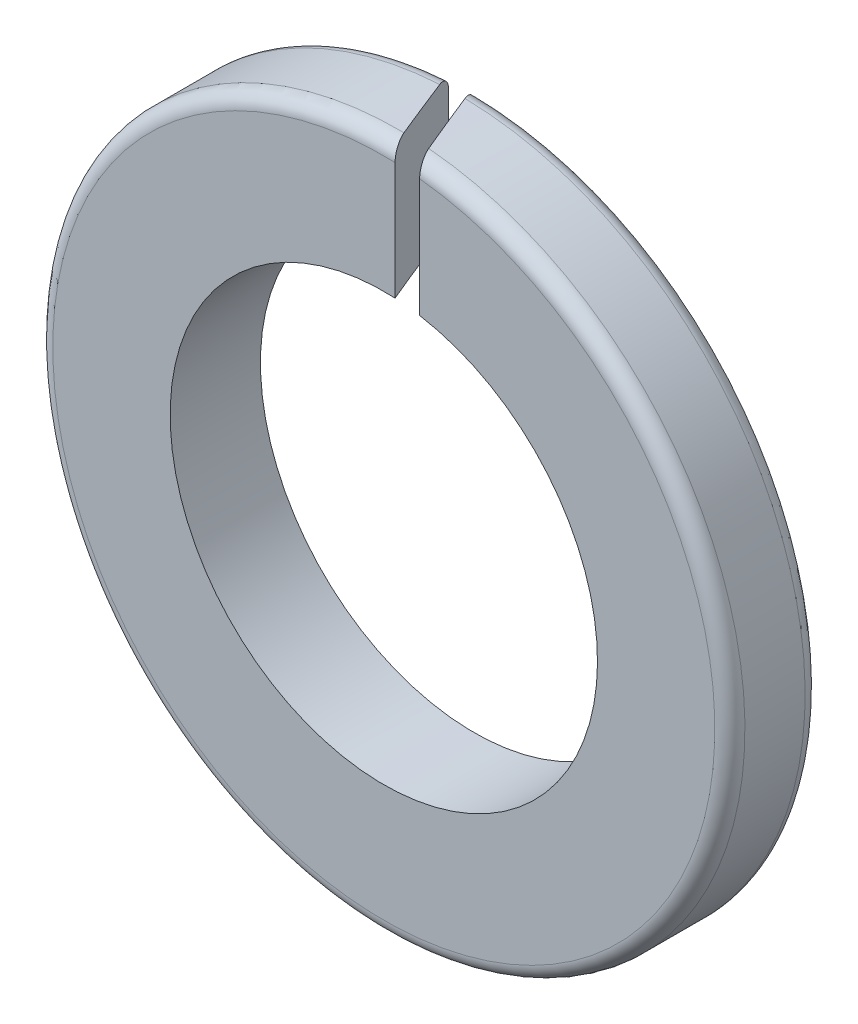
ISO-10303-21;
HEADER;
FILE_DESCRIPTION(('STEP AP214'),'2;1');
FILE_NAME('part.step','',(''),(''),'','','');
FILE_SCHEMA(('AUTOMOTIVE_DESIGN { 1 0 10303 214 1 1 1 1 }'));
ENDSEC;
DATA;
#1=APPLICATION_CONTEXT('core data for automotive mechanical design processes');
#2=APPLICATION_PROTOCOL_DEFINITION('international standard','automotive_design',2000,#1);
#3=PRODUCT_CONTEXT('',#1,'mechanical');
#4=PRODUCT('Part','Part','',(#3));
#5=PRODUCT_RELATED_PRODUCT_CATEGORY('part','',(#4));
#6=PRODUCT_DEFINITION_FORMATION('','',#4);
#7=PRODUCT_DEFINITION_CONTEXT('part definition',#1,'design');
#8=PRODUCT_DEFINITION('design','',#6,#7);
#9=PRODUCT_DEFINITION_SHAPE('','',#8);
#10=(LENGTH_UNIT() NAMED_UNIT(*) SI_UNIT(.MILLI.,.METRE.));
#11=(NAMED_UNIT(*) PLANE_ANGLE_UNIT() SI_UNIT($,.RADIAN.));
#12=(NAMED_UNIT(*) SI_UNIT($,.STERADIAN.) SOLID_ANGLE_UNIT());
#13=UNCERTAINTY_MEASURE_WITH_UNIT(LENGTH_MEASURE(1.E-05),#10,'distance_accuracy_value','');
#14=(GEOMETRIC_REPRESENTATION_CONTEXT(3) GLOBAL_UNCERTAINTY_ASSIGNED_CONTEXT((#13)) GLOBAL_UNIT_ASSIGNED_CONTEXT((#10,
#11,#12)) REPRESENTATION_CONTEXT('',''));
#15=CARTESIAN_POINT('',(0.,0.,0.));
#16=DIRECTION('',(0.,0.,1.));
#17=DIRECTION('',(1.,0.,0.));
#18=AXIS2_PLACEMENT_3D('',#15,#16,#17);
#19=CARTESIAN_POINT('',(0.,0.,3.));
#20=DIRECTION('',(0.,0.,1.));
#21=DIRECTION('',(1.,0.,0.));
#22=AXIS2_PLACEMENT_3D('',#19,#20,#21);
#23=PLANE('',#22);
#24=CARTESIAN_POINT('',(0.,0.,3.));
#25=DIRECTION('',(0.,0.,1.));
#26=DIRECTION('',(1.,0.,0.));
#27=AXIS2_PLACEMENT_3D('',#24,#25,#26);
#28=CIRCLE('',#27,7.1);
#29=CARTESIAN_POINT('',(0.373498300515705,7.09016918130392,3.));
#30=VERTEX_POINT('',#29);
#31=CARTESIAN_POINT('',(1.19000632074208,6.99956319755696,3.));
#32=VERTEX_POINT('',#31);
#33=EDGE_CURVE('E112',#30,#32,#28,.T.);
#34=ORIENTED_EDGE('',*,*,#33,.F.);
#35=DIRECTION('',(0.,1.,0.));
#36=VECTOR('',#35,1.);
#37=CARTESIAN_POINT('',(0.373498300515705,0.,3.));
#38=LINE('',#37,#36);
#39=CARTESIAN_POINT('',(0.373498300515705,10.9936572176647,3.));
#40=VERTEX_POINT('',#39);
#41=EDGE_CURVE('E170',#30,#40,#38,.T.);
#42=ORIENTED_EDGE('',*,*,#41,.T.);
#43=CARTESIAN_POINT('',(0.,0.,3.));
#44=DIRECTION('',(0.,0.,1.));
#45=DIRECTION('',(1.,0.,0.));
#46=AXIS2_PLACEMENT_3D('',#43,#44,#45);
#47=CIRCLE('',#46,11.);
#48=CARTESIAN_POINT('',(1.19000632074208,10.935441690055,3.));
#49=VERTEX_POINT('',#48);
#50=EDGE_CURVE('E101',#40,#49,#47,.T.);
#51=ORIENTED_EDGE('',*,*,#50,.T.);
#52=DIRECTION('',(0.,-1.,0.));
#53=VECTOR('',#52,1.);
#54=CARTESIAN_POINT('',(1.19000632074208,0.,3.));
#55=LINE('',#54,#53);
#56=EDGE_CURVE('E58',#49,#32,#55,.T.);
#57=ORIENTED_EDGE('',*,*,#56,.T.);
#58=EDGE_LOOP('',(#34,#42,#51,#57));
#59=FACE_BOUND('',#58,.T.);
#60=ADVANCED_FACE('F36',(#59),#23,.T.);
#61=CARTESIAN_POINT('',(0.,0.,0.));
#62=DIRECTION('',(0.,0.,1.));
#63=DIRECTION('',(1.,0.,0.));
#64=AXIS2_PLACEMENT_3D('',#61,#62,#63);
#65=PLANE('',#64);
#66=DIRECTION('',(0.,1.,0.));
#67=VECTOR('',#66,1.);
#68=CARTESIAN_POINT('',(-0.845251699484295,0.,0.));
#69=LINE('',#68,#67);
#70=CARTESIAN_POINT('',(-0.845251699484295,7.04950704407896,0.));
#71=VERTEX_POINT('',#70);
#72=CARTESIAN_POINT('',(-0.845251699484295,10.9674769005692,0.));
#73=VERTEX_POINT('',#72);
#74=EDGE_CURVE('E175',#71,#73,#69,.T.);
#75=ORIENTED_EDGE('',*,*,#74,.F.);
#76=CARTESIAN_POINT('',(0.,0.,0.));
#77=DIRECTION('',(0.,0.,1.));
#78=DIRECTION('',(1.,0.,0.));
#79=AXIS2_PLACEMENT_3D('',#76,#77,#78);
#80=CIRCLE('',#79,7.1);
#81=CARTESIAN_POINT('',(-0.00195796497220551,7.09999973002627,0.));
#82=VERTEX_POINT('',#81);
#83=EDGE_CURVE('E120',#71,#82,#80,.T.);
#84=ORIENTED_EDGE('',*,*,#83,.T.);
#85=DIRECTION('',(0.,-1.,0.));
#86=VECTOR('',#85,1.);
#87=CARTESIAN_POINT('',(-0.00195796497220559,0.,0.));
#88=LINE('',#87,#86);
#89=CARTESIAN_POINT('',(-0.00195796497220562,10.9999998257442,0.));
#90=VERTEX_POINT('',#89);
#91=EDGE_CURVE('E183',#90,#82,#88,.T.);
#92=ORIENTED_EDGE('',*,*,#91,.F.);
#93=CARTESIAN_POINT('',(0.,0.,0.));
#94=DIRECTION('',(0.,0.,1.));
#95=DIRECTION('',(1.,0.,0.));
#96=AXIS2_PLACEMENT_3D('',#93,#94,#95);
#97=CIRCLE('',#96,11.);
#98=EDGE_CURVE('E117',#90,#73,#97,.F.);
#99=ORIENTED_EDGE('',*,*,#98,.T.);
#100=EDGE_LOOP('',(#75,#84,#92,#99));
#101=FACE_BOUND('',#100,.T.);
#102=ADVANCED_FACE('F182',(#101),#65,.F.);
#103=CARTESIAN_POINT('',(0.,0.,3.));
#104=DIRECTION('',(0.,0.,-1.));
#105=DIRECTION('',(-1.,0.,0.));
#106=AXIS2_PLACEMENT_3D('',#103,#104,#105);
#107=CYLINDRICAL_SURFACE('',#106,11.5);
#108=CARTESIAN_POINT('',(0.,0.,2.08061956796134));
#109=DIRECTION('',(0.926466577122309,0.,-0.376377046955938));
#110=DIRECTION('',(-0.376377046955938,0.,-0.926466577122309));
#111=AXIS2_PLACEMENT_3D('',#108,#109,#110);
#112=ELLIPSE('',#111,30.5544668385325,11.5);
#113=CARTESIAN_POINT('',(-0.642126699484295,11.4820587571136,0.5));
#114=VERTEX_POINT('',#113);
#115=CARTESIAN_POINT('',(0.170373300515705,11.4987378845885,2.5));
#116=VERTEX_POINT('',#115);
#117=EDGE_CURVE('E66',#114,#116,#112,.T.);
#118=ORIENTED_EDGE('',*,*,#117,.F.);
#119=CARTESIAN_POINT('',(0.,0.,0.5));
#120=DIRECTION('',(0.,0.,1.));
#121=DIRECTION('',(1.,0.,0.));
#122=AXIS2_PLACEMENT_3D('',#119,#120,#121);
#123=CIRCLE('',#122,11.5);
#124=CARTESIAN_POINT('',(0.196702749313509,11.4983176173044,0.5));
#125=VERTEX_POINT('',#124);
#126=EDGE_CURVE('E107',#114,#125,#123,.T.);
#127=ORIENTED_EDGE('',*,*,#126,.T.);
#128=CARTESIAN_POINT('',(0.,0.,0.00492791184015769));
#129=DIRECTION('',(-0.929332584688145,0.,0.369243750166272));
#130=DIRECTION('',(-0.369243750166272,0.,-0.929332584688145));
#131=AXIS2_PLACEMENT_3D('',#128,#129,#130);
#132=ELLIPSE('',#131,31.1447383870993,11.5);
#133=CARTESIAN_POINT('',(0.991345606456366,11.4571913612613,2.5));
#134=VERTEX_POINT('',#133);
#135=EDGE_CURVE('E94',#134,#125,#132,.T.);
#136=ORIENTED_EDGE('',*,*,#135,.F.);
#137=CARTESIAN_POINT('',(0.,0.,2.5));
#138=DIRECTION('',(0.,0.,1.));
#139=DIRECTION('',(1.,0.,0.));
#140=AXIS2_PLACEMENT_3D('',#137,#138,#139);
#141=CIRCLE('',#140,11.5);
#142=EDGE_CURVE('E105',#134,#116,#141,.F.);
#143=ORIENTED_EDGE('',*,*,#142,.T.);
#144=EDGE_LOOP('',(#118,#127,#136,#143));
#145=FACE_BOUND('',#144,.T.);
#146=ADVANCED_FACE('F38',(#145),#107,.T.);
#147=CARTESIAN_POINT('',(0.,0.,3.));
#148=DIRECTION('',(0.,0.,-1.));
#149=DIRECTION('',(-1.,0.,0.));
#150=AXIS2_PLACEMENT_3D('',#147,#148,#149);
#151=CYLINDRICAL_SURFACE('',#150,7.1);
#152=ORIENTED_EDGE('',*,*,#83,.F.);
#153=CARTESIAN_POINT('',(0.,0.,2.08061956796134));
#154=DIRECTION('',(0.926466577122309,0.,-0.376377046955938));
#155=DIRECTION('',(-0.376377046955938,0.,-0.926466577122309));
#156=AXIS2_PLACEMENT_3D('',#153,#154,#155);
#157=ELLIPSE('',#156,18.864062135094,7.1);
#158=EDGE_CURVE('E169',#71,#30,#157,.T.);
#159=ORIENTED_EDGE('',*,*,#158,.T.);
#160=ORIENTED_EDGE('',*,*,#33,.T.);
#161=CARTESIAN_POINT('',(0.,0.,0.00492791184015769));
#162=DIRECTION('',(-0.929332584688145,0.,0.369243750166272));
#163=DIRECTION('',(-0.369243750166272,0.,-0.929332584688145));
#164=AXIS2_PLACEMENT_3D('',#161,#162,#163);
#165=ELLIPSE('',#164,19.2284906563831,7.1);
#166=EDGE_CURVE('E149',#32,#82,#165,.T.);
#167=ORIENTED_EDGE('',*,*,#166,.T.);
#168=EDGE_LOOP('',(#152,#159,#160,#167));
#169=FACE_BOUND('',#168,.T.);
#170=ADVANCED_FACE('F155',(#169),#151,.F.);
#171=CARTESIAN_POINT('',(0.,0.,0.5));
#172=DIRECTION('',(0.,0.,1.));
#173=DIRECTION('',(1.,0.,0.));
#174=AXIS2_PLACEMENT_3D('',#171,#172,#173);
#175=TOROIDAL_SURFACE('',#174,11.,0.5);
#176=ORIENTED_EDGE('',*,*,#126,.F.);
#177=CARTESIAN_POINT('',(-0.642045449484269,11.4820632606164,0.500200000000063));
#178=CARTESIAN_POINT('',(-0.654258598702899,11.4814079493409,0.470136863461899));
#179=CARTESIAN_POINT('',(-0.666448630020751,11.4779885558861,0.440130632525647));
#180=CARTESIAN_POINT('',(-0.690453588405312,11.4658030531494,0.38104150419442));
#181=CARTESIAN_POINT('',(-0.702268231221579,11.4570329891969,0.351959306492839));
#182=CARTESIAN_POINT('',(-0.725182290631446,11.4343213584534,0.295555467945474));
#183=CARTESIAN_POINT('',(-0.73628121322523,11.4203762636952,0.268235043099237));
#184=CARTESIAN_POINT('',(-0.757410259268984,11.3876308916428,0.21622508360692));
#185=CARTESIAN_POINT('',(-0.767440892145689,11.3688329432655,0.191534294987338));
#186=CARTESIAN_POINT('',(-0.785883814858542,11.3272874138575,0.14613633138647));
#187=CARTESIAN_POINT('',(-0.794327519018434,11.3046385434662,0.125351828839042));
#188=CARTESIAN_POINT('',(-0.809549754047361,11.2556719825768,0.0878817118447604));
#189=CARTESIAN_POINT('',(-0.816328618319865,11.2293550283126,0.071195276712444));
#190=CARTESIAN_POINT('',(-0.827552004878265,11.1755646815616,0.0435684790302295));
#191=CARTESIAN_POINT('',(-0.832116630347222,11.1482684304085,0.0323324778758724));
#192=CARTESIAN_POINT('',(-0.839300624376227,11.0919253940938,0.014648800266015));
#193=CARTESIAN_POINT('',(-0.841921121472144,11.0628796350985,0.00819834587606359));
#194=CARTESIAN_POINT('',(-0.84495108842966,11.0061669881357,0.000739965672949131));
#195=CARTESIAN_POINT('',(-0.845509034615094,10.9785558595512,-0.00063344032196663));
#196=CARTESIAN_POINT('',(-0.844775665753036,10.9235091427653,0.00117177533848285));
#197=CARTESIAN_POINT('',(-0.843484979174917,10.8960734980902,0.00434884999231517));
#198=CARTESIAN_POINT('',(-0.839193262112444,10.8435709524997,0.0149130766076351));
#199=CARTESIAN_POINT('',(-0.836278747290321,10.8184537893962,0.0220872669390125));
#200=CARTESIAN_POINT('',(-0.828901461509359,10.7698832595926,0.0402467396306129));
#201=CARTESIAN_POINT('',(-0.824438779767461,10.7464297971114,0.0512318023798998));
#202=CARTESIAN_POINT('',(-0.814122993606206,10.7018216185503,0.0766245067768358));
#203=CARTESIAN_POINT('',(-0.808270868633419,10.6806652984093,0.0910297374790807));
#204=CARTESIAN_POINT('',(-0.795368867580067,10.6411184568394,0.122788509302716));
#205=CARTESIAN_POINT('',(-0.788318852954329,10.6227282557977,0.140142391458378));
#206=CARTESIAN_POINT('',(-0.772878812974318,10.5882703239843,0.178148643716866));
#207=CARTESIAN_POINT('',(-0.764441218656654,10.5723533453591,0.198918106652654));
#208=CARTESIAN_POINT('',(-0.746736030224175,10.5441935762421,0.242500108947988));
#209=CARTESIAN_POINT('',(-0.737467936432077,10.5319530172344,0.265313878282383));
#210=CARTESIAN_POINT('',(-0.717610771744344,10.5104999214882,0.314193052898342));
#211=CARTESIAN_POINT('',(-0.706974941007266,10.5015933408212,0.340373559328071));
#212=CARTESIAN_POINT('',(-0.685323320526046,10.4882954696662,0.393669855897229));
#213=CARTESIAN_POINT('',(-0.674307910757505,10.4838997919176,0.420784710712098));
#214=CARTESIAN_POINT('',(-0.656183371810496,10.4803724828599,0.465398960427812));
#215=CARTESIAN_POINT('',(-0.649108213201116,10.4799089833551,0.482814735466288));
#216=CARTESIAN_POINT('',(-0.642045449484295,10.4803520208434,0.5002));
#217=B_SPLINE_CURVE_WITH_KNOTS('',3,(#177,#178,#179,#180,#181,#182,#183,#184,#185,#186,#187,
#188,#189,#190,#191,#192,#193,#194,#195,#196,#197,#198,#199,#200,#201,#202,#203,#204,#205,#206,
#207,#208,#209,#210,#211,#212,#213,#214,#215,#216),.UNSPECIFIED.,.F.,.F.,(4,2,2,2,2,2,2,2,2,2,2,
2,2,2,2,2,2,2,2,4),(0.,0.0972475119019454,0.194566986476512,0.291952928775857,0.389292221506854,
0.484434735523902,0.579558180585539,0.668692385709213,0.757774809260905,0.84030370202262,
0.922804544555464,1.00128037091192,1.07975167565607,1.15816782777434,1.23659305550626,
1.31872306694173,1.40090282872552,1.48941417991641,1.57783936400169,1.63415624704543),.UNSPECIFIED.);
#218=EDGE_CURVE('E160',#114,#73,#217,.T.);
#219=ORIENTED_EDGE('',*,*,#218,.T.);
#220=ORIENTED_EDGE('',*,*,#98,.F.);
#221=CARTESIAN_POINT('',(0.196782213599223,10.4981559142742,0.5002));
#222=CARTESIAN_POINT('',(0.184840524327013,10.4983544356306,0.470144512393539));
#223=CARTESIAN_POINT('',(0.172903254503782,10.501269176974,0.440100147894619));
#224=CARTESIAN_POINT('',(0.149351366721263,10.5124248351066,0.380823486509402));
#225=CARTESIAN_POINT('',(0.13773736431382,10.5206752728726,0.351592738877188));
#226=CARTESIAN_POINT('',(0.115177644494427,10.5424073605665,0.294813219331749));
#227=CARTESIAN_POINT('',(0.104232732686036,10.5558951782487,0.267266475005013));
#228=CARTESIAN_POINT('',(0.0833891069205121,10.5878478223105,0.214806113527739));
#229=CARTESIAN_POINT('',(0.073489502527608,10.6063083643249,0.189890255280429));
#230=CARTESIAN_POINT('',(0.0554647758965463,10.64697742217,0.144524651175285));
#231=CARTESIAN_POINT('',(0.0472843708547675,10.6690057208408,0.123935766575753));
#232=CARTESIAN_POINT('',(0.0325439096800775,10.7167450702245,0.0868361789001284));
#233=CARTESIAN_POINT('',(0.0259833476350243,10.7424549671205,0.0703242025170731));
#234=CARTESIAN_POINT('',(0.0152159702409845,10.7946781996552,0.0432242863792649));
#235=CARTESIAN_POINT('',(0.0108663727743136,10.820975667088,0.032276984890116));
#236=CARTESIAN_POINT('',(0.00399130366541016,10.8752623550262,0.0149734401665838));
#237=CARTESIAN_POINT('',(0.00146487187155355,10.9032506766315,0.0086147803708095));
#238=CARTESIAN_POINT('',(-0.00154567826620442,10.9581304050994,0.00103766541735132));
#239=CARTESIAN_POINT('',(-0.00215346296880821,10.9849724752675,-0.000492039901561273));
#240=CARTESIAN_POINT('',(-0.00165265275161766,11.0385366929726,0.000768426263053348));
#241=CARTESIAN_POINT('',(-0.000544341269587974,11.0652588595825,0.00355788437512795));
#242=CARTESIAN_POINT('',(0.00329645701667003,11.1171792120136,0.013224612646159));
#243=CARTESIAN_POINT('',(0.00599052706983755,11.142398394688,0.020005193454131));
#244=CARTESIAN_POINT('',(0.0128686090356349,11.1912960147816,0.037316321098385));
#245=CARTESIAN_POINT('',(0.0170527247152368,11.2149743447596,0.0478471291009785));
#246=CARTESIAN_POINT('',(0.0268791465770279,11.2607450781902,0.0725787976070598));
#247=CARTESIAN_POINT('',(0.0325535684149154,11.2827867956512,0.0868604885248891));
#248=CARTESIAN_POINT('',(0.0451208046144628,11.3241487632521,0.118490386375435));
#249=CARTESIAN_POINT('',(0.0520138185043986,11.3434685667824,0.135839095491678));
#250=CARTESIAN_POINT('',(0.0672247795641615,11.3799930971878,0.174122862653328));
#251=CARTESIAN_POINT('',(0.0756005657968464,11.3970210083396,0.195203493171547));
#252=CARTESIAN_POINT('',(0.0932379481339279,11.4273068646902,0.239594208267123));
#253=CARTESIAN_POINT('',(0.102500083463882,11.4405624952225,0.262905649996446));
#254=CARTESIAN_POINT('',(0.122295134286453,11.4638261968672,0.312726901504937));
#255=CARTESIAN_POINT('',(0.132871572070997,11.4735625291413,0.3393462505357));
#256=CARTESIAN_POINT('',(0.154449266408469,11.4883365701895,0.393654155385069));
#257=CARTESIAN_POINT('',(0.165449996428648,11.4933799190766,0.421341385997654));
#258=CARTESIAN_POINT('',(0.183260342713089,11.4976883670423,0.466167426084338));
#259=CARTESIAN_POINT('',(0.19002427805355,11.4984428089321,0.483191263345722));
#260=CARTESIAN_POINT('',(0.196782213599166,11.4983162176212,0.500199999999855));
#261=B_SPLINE_CURVE_WITH_KNOTS('',3,(#221,#222,#223,#224,#225,#226,#227,#228,#229,#230,#231,
#232,#233,#234,#235,#236,#237,#238,#239,#240,#241,#242,#243,#244,#245,#246,#247,#248,#249,#250,
#251,#252,#253,#254,#255,#256,#257,#258,#259,#260),.UNSPECIFIED.,.F.,.F.,(4,2,2,2,2,2,2,2,2,2,2,
2,2,2,2,2,2,2,2,4),(0.,0.0969234614036401,0.194020351290687,0.29123193496591,0.388360030178622,
0.481588855734962,0.574788526967835,0.66078116643724,0.746728485643605,0.827009376641412,
0.907277009519187,0.985675758479521,1.06407996820697,1.14433655389804,1.22460629273142,
1.30932947824777,1.39410453825625,1.48446895604375,1.57472463142885,1.62963714386343),.UNSPECIFIED.);
#262=EDGE_CURVE('E141',#90,#125,#261,.T.);
#263=ORIENTED_EDGE('',*,*,#262,.T.);
#264=EDGE_LOOP('',(#176,#219,#220,#263));
#265=FACE_BOUND('',#264,.T.);
#266=ADVANCED_FACE('F151',(#265),#175,.T.);
#267=CARTESIAN_POINT('',(0.,0.,2.5));
#268=DIRECTION('',(0.,0.,1.));
#269=DIRECTION('',(1.,0.,0.));
#270=AXIS2_PLACEMENT_3D('',#267,#268,#269);
#271=TOROIDAL_SURFACE('',#270,11.,0.5);
#272=ORIENTED_EDGE('',*,*,#50,.F.);
#273=CARTESIAN_POINT('',(0.170292050515706,10.4986190262116,2.4998));
#274=CARTESIAN_POINT('',(0.182426866479166,10.4983965802133,2.52967031621775));
#275=CARTESIAN_POINT('',(0.194572976766152,10.5008571972904,2.55956843384725));
#276=CARTESIAN_POINT('',(0.218572451534017,10.5110894591666,2.61864406404508));
#277=CARTESIAN_POINT('',(0.230425063930798,10.5188735266596,2.64781972532946));
#278=CARTESIAN_POINT('',(0.253479656949201,10.5397138530918,2.70456949275937));
#279=CARTESIAN_POINT('',(0.264680621623713,10.5527781047396,2.73214109811202));
#280=CARTESIAN_POINT('',(0.286028456761222,10.5839612407333,2.78468961537358));
#281=CARTESIAN_POINT('',(0.296176455652219,10.6020746356807,2.80966930495142));
#282=CARTESIAN_POINT('',(0.314570606170966,10.6419617373565,2.85494721392064));
#283=CARTESIAN_POINT('',(0.322886230703745,10.6635086774374,2.87541644353979));
#284=CARTESIAN_POINT('',(0.337889111913778,10.7103013823043,2.91234661267218));
#285=CARTESIAN_POINT('',(0.344576902475804,10.7355459300139,2.92880886636332));
#286=CARTESIAN_POINT('',(0.355548790207243,10.7867606325926,2.95581659000994));
#287=CARTESIAN_POINT('',(0.359985294708997,10.8125005240696,2.96673721647579));
#288=CARTESIAN_POINT('',(0.367046203941112,10.8656753927043,2.98411791612408));
#289=CARTESIAN_POINT('',(0.369671513371886,10.8931095161129,2.99058021626137));
#290=CARTESIAN_POINT('',(0.372900637940848,10.9470758901224,2.99852883058497));
#291=CARTESIAN_POINT('',(0.373618434732435,10.9735604391486,3.00029571499502));
#292=CARTESIAN_POINT('',(0.373345391210288,11.0264647097484,2.99962360786359));
#293=CARTESIAN_POINT('',(0.372354732651719,11.0528844379184,2.99718506371942));
#294=CARTESIAN_POINT('',(0.368739773091155,11.1045650762852,2.98828670172418));
#295=CARTESIAN_POINT('',(0.366136624721639,11.1298365138604,2.98187895189153));
#296=CARTESIAN_POINT('',(0.359422544456408,11.1789196864832,2.96535198508481));
#297=CARTESIAN_POINT('',(0.355311435125056,11.2027312493684,2.95523233134609));
#298=CARTESIAN_POINT('',(0.34556495473302,11.2491123445685,2.93124099499647));
#299=CARTESIAN_POINT('',(0.339882242556749,11.2716115025564,2.91725278040872));
#300=CARTESIAN_POINT('',(0.327254860712945,11.3139465987245,2.88616999433167));
#301=CARTESIAN_POINT('',(0.320309940946946,11.3337820077429,2.86907480721536));
#302=CARTESIAN_POINT('',(0.304895534627047,11.3715541466349,2.83113165319715));
#303=CARTESIAN_POINT('',(0.296357812672918,11.3892942020428,2.81011572223314));
#304=CARTESIAN_POINT('',(0.278338907987598,11.4210035100701,2.76576149531543));
#305=CARTESIAN_POINT('',(0.268857141109514,11.4349704078765,2.74242176146168));
#306=CARTESIAN_POINT('',(0.248536052332551,11.459702190482,2.69240061985685));
#307=CARTESIAN_POINT('',(0.237648278545026,11.4701860692278,2.66559994591833));
#308=CARTESIAN_POINT('',(0.215394802584977,11.4863803378908,2.61082215893975));
#309=CARTESIAN_POINT('',(0.204029687016428,11.4920964165109,2.58284648984793));
#310=CARTESIAN_POINT('',(0.185170125755269,11.4975214985172,2.53642295443585));
#311=CARTESIAN_POINT('',(0.177730178817953,11.498640917965,2.51810923889784));
#312=CARTESIAN_POINT('',(0.170292050515665,11.4987390481535,2.4997999999999));
#313=B_SPLINE_CURVE_WITH_KNOTS('',3,(#273,#274,#275,#276,#277,#278,#279,#280,#281,#282,#283,
#284,#285,#286,#287,#288,#289,#290,#291,#292,#293,#294,#295,#296,#297,#298,#299,#300,#301,#302,
#303,#304,#305,#306,#307,#308,#309,#310,#311,#312),.UNSPECIFIED.,.F.,.F.,(4,2,2,2,2,2,2,2,2,2,2,
2,2,2,2,2,2,2,2,4),(0.,0.0966369699071597,0.193500222813734,0.290510651796442,0.387416020231388,
0.479503285448333,0.571560307756013,0.656049391106347,0.740496241148698,0.819770019154695,
0.899035364087085,0.977282304749722,1.05553845536687,1.13647221808249,1.21742203483047,
1.30344091607417,1.38951335799378,1.48141654450723,1.57320991919731,1.63249777980639),.UNSPECIFIED.);
#314=EDGE_CURVE('E11',#40,#116,#313,.T.);
#315=ORIENTED_EDGE('',*,*,#314,.T.);
#316=ORIENTED_EDGE('',*,*,#142,.F.);
#317=CARTESIAN_POINT('',(0.991266142170651,11.4571981965656,2.4998));
#318=CARTESIAN_POINT('',(1.00325111850337,11.4561887478681,2.52996443481492));
#319=CARTESIAN_POINT('',(1.01519988626281,11.4523940769567,2.56003773793982));
#320=CARTESIAN_POINT('',(1.03870012844334,11.4394593605751,2.61918441488857));
#321=CARTESIAN_POINT('',(1.05025149310969,11.4303178507666,2.64825751247578));
#322=CARTESIAN_POINT('',(1.07262968367346,11.4069105601048,2.70458014940034));
#323=CARTESIAN_POINT('',(1.0834562124325,11.3926426928336,2.73182894088376));
#324=CARTESIAN_POINT('',(1.10405422169916,11.3593285977299,2.78367112150996));
#325=CARTESIAN_POINT('',(1.11382602972211,11.340283859368,2.80826533496097));
#326=CARTESIAN_POINT('',(1.13187142102771,11.2981536114248,2.85368294903349));
#327=CARTESIAN_POINT('',(1.14016359829317,11.2751266732693,2.87455314799375));
#328=CARTESIAN_POINT('',(1.15510352856649,11.2254323674295,2.9121547702547));
#329=CARTESIAN_POINT('',(1.1617515406139,11.198765574236,2.92888684552008));
#330=CARTESIAN_POINT('',(1.17279257494797,11.1441243029033,2.95667551620359));
#331=CARTESIAN_POINT('',(1.17729080185834,11.1163060388403,2.96799689629261));
#332=CARTESIAN_POINT('',(1.18434293443924,11.0589162316582,2.98574608391194));
#333=CARTESIAN_POINT('',(1.18689794414243,11.0293456943975,2.99217667013122));
#334=CARTESIAN_POINT('',(1.18979598302011,10.9716515264411,2.99947061067729));
#335=CARTESIAN_POINT('',(1.19028883695548,10.9435829598597,3.00071105204271));
#336=CARTESIAN_POINT('',(1.18941465462577,10.8876601987768,2.99851086280838));
#337=CARTESIAN_POINT('',(1.18804836211411,10.85980592303,2.99507210412736));
#338=CARTESIAN_POINT('',(1.18361016029261,10.806786276661,2.98390179841931));
#339=CARTESIAN_POINT('',(1.18063988549094,10.781558130529,2.97642605060386));
#340=CARTESIAN_POINT('',(1.17315716853875,10.7328427103964,2.95759314501634));
#341=CARTESIAN_POINT('',(1.16864490987758,10.7093552296686,2.94623644906014));
#342=CARTESIAN_POINT('',(1.15829330450835,10.6650389675012,2.92018297037803));
#343=CARTESIAN_POINT('',(1.15247065360149,10.6441814875064,2.90552820854504));
#344=CARTESIAN_POINT('',(1.1396585887894,10.6052933275133,2.87328211283819));
#345=CARTESIAN_POINT('',(1.1326690902917,10.5872628526471,2.85569056605748));
#346=CARTESIAN_POINT('',(1.11745380466659,10.5537652314207,2.81739591459653));
#347=CARTESIAN_POINT('',(1.1091912595085,10.5384208147535,2.79660029532222));
#348=CARTESIAN_POINT('',(1.09188173486414,10.5114096873416,2.75303475014991));
#349=CARTESIAN_POINT('',(1.08283430111943,10.4997451246824,2.73026368094972));
#350=CARTESIAN_POINT('',(1.06351736389647,10.4795192392017,2.68164577153464));
#351=CARTESIAN_POINT('',(1.05320684657506,10.4712457974634,2.65569570546727));
#352=CARTESIAN_POINT('',(1.03224843987902,10.4591426235101,2.60294645715364));
#353=CARTESIAN_POINT('',(1.02160088825365,10.4553085788051,2.57614812497294));
#354=CARTESIAN_POINT('',(1.00436881367328,10.4526591207337,2.53277751029874));
#355=CARTESIAN_POINT('',(0.997810007146724,10.4524740377487,2.51626995229933));
#356=CARTESIAN_POINT('',(0.991266142170655,10.4531044324347,2.49980000000001));
#357=B_SPLINE_CURVE_WITH_KNOTS('',3,(#317,#318,#319,#320,#321,#322,#323,#324,#325,#326,#327,
#328,#329,#330,#331,#332,#333,#334,#335,#336,#337,#338,#339,#340,#341,#342,#343,#344,#345,#346,
#347,#348,#349,#350,#351,#352,#353,#354,#355,#356),.UNSPECIFIED.,.F.,.F.,(4,2,2,2,2,2,2,2,2,2,2,
2,2,2,2,2,2,2,2,4),(0.,0.0972910655175087,0.19460878861689,0.291966164798859,0.389293221744549,
0.485294615034589,0.581280873579766,0.671906294868568,0.762480189070617,0.846345221642493,
0.930176713784713,1.00923092482769,1.08827573203868,1.16636534113491,1.2444606139207,
1.32550934404532,1.40660529854884,1.49360748575163,1.58052508676756,1.63373426024255),.UNSPECIFIED.);
#358=EDGE_CURVE('E51',#134,#49,#357,.T.);
#359=ORIENTED_EDGE('',*,*,#358,.T.);
#360=EDGE_LOOP('',(#272,#315,#316,#359));
#361=FACE_BOUND('',#360,.T.);
#362=ADVANCED_FACE('F110',(#361),#271,.T.);
#363=CARTESIAN_POINT('',(-0.862634786685419,11.5,-2.16619784341303));
#364=DIRECTION('',(-0.929332584688145,0.,0.369243750166272));
#365=DIRECTION('',(0.369243750166272,0.,0.929332584688145));
#366=AXIS2_PLACEMENT_3D('',#363,#364,#365);
#367=PLANE('',#366);
#368=ORIENTED_EDGE('',*,*,#91,.T.);
#369=ORIENTED_EDGE('',*,*,#166,.F.);
#370=ORIENTED_EDGE('',*,*,#56,.F.);
#371=ORIENTED_EDGE('',*,*,#358,.F.);
#372=ORIENTED_EDGE('',*,*,#135,.T.);
#373=ORIENTED_EDGE('',*,*,#262,.F.);
#374=EDGE_LOOP('',(#368,#369,#370,#371,#372,#373));
#375=FACE_BOUND('',#374,.T.);
#376=ADVANCED_FACE('F93',(#375),#367,.T.);
#377=CARTESIAN_POINT('',(-1.72526957337084,11.5,-2.16619784341303));
#378=DIRECTION('',(0.926466577122309,0.,-0.376377046955938));
#379=DIRECTION('',(-0.376377046955938,0.,-0.926466577122309));
#380=AXIS2_PLACEMENT_3D('',#377,#378,#379);
#381=PLANE('',#380);
#382=ORIENTED_EDGE('',*,*,#74,.T.);
#383=ORIENTED_EDGE('',*,*,#218,.F.);
#384=ORIENTED_EDGE('',*,*,#117,.T.);
#385=ORIENTED_EDGE('',*,*,#314,.F.);
#386=ORIENTED_EDGE('',*,*,#41,.F.);
#387=ORIENTED_EDGE('',*,*,#158,.F.);
#388=EDGE_LOOP('',(#382,#383,#384,#385,#386,#387));
#389=FACE_BOUND('',#388,.T.);
#390=ADVANCED_FACE('F137',(#389),#381,.T.);
#391=CLOSED_SHELL('',(#60,#102,#146,#170,#266,#362,#376,#390));
#392=MANIFOLD_SOLID_BREP('B2',#391);
#393=ADVANCED_BREP_SHAPE_REPRESENTATION('',(#18,#392),#14);
#394=SHAPE_DEFINITION_REPRESENTATION(#9,#393);
ENDSEC;
END-ISO-10303-21;
